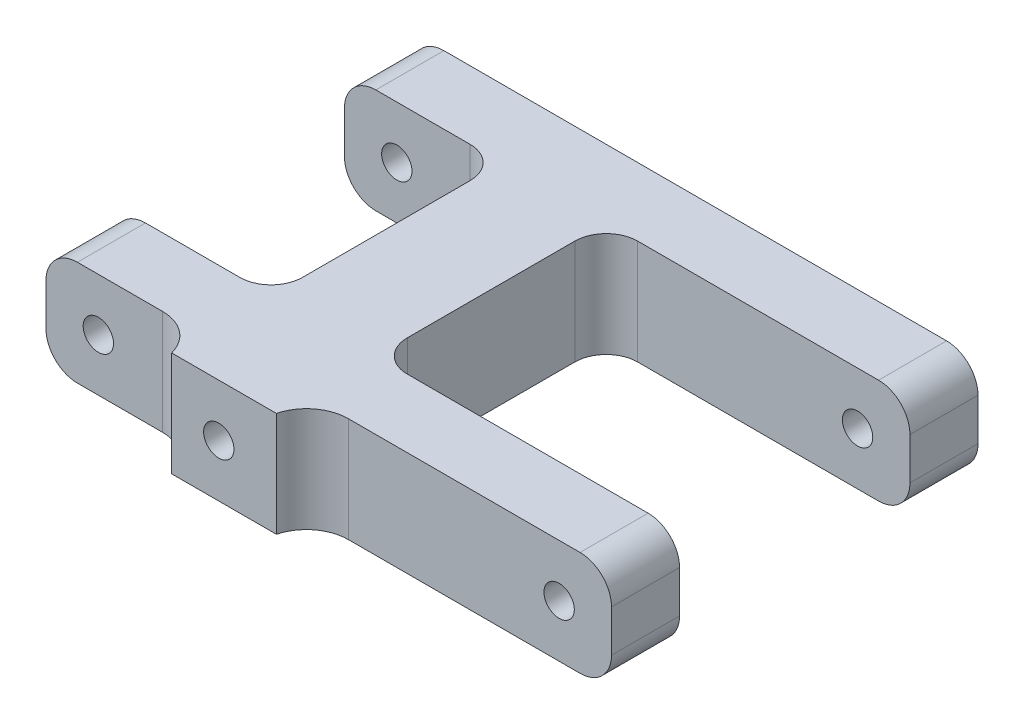
ISO-10303-21;
HEADER;
FILE_DESCRIPTION(('STEP AP214'),'2;1');
FILE_NAME('part.step','',(''),(''),'','','');
FILE_SCHEMA(('AUTOMOTIVE_DESIGN { 1 0 10303 214 1 1 1 1 }'));
ENDSEC;
DATA;
#1=APPLICATION_CONTEXT('core data for automotive mechanical design processes');
#2=APPLICATION_PROTOCOL_DEFINITION('international standard','automotive_design',2000,#1);
#3=PRODUCT_CONTEXT('',#1,'mechanical');
#4=PRODUCT('Part','Part','',(#3));
#5=PRODUCT_RELATED_PRODUCT_CATEGORY('part','',(#4));
#6=PRODUCT_DEFINITION_FORMATION('','',#4);
#7=PRODUCT_DEFINITION_CONTEXT('part definition',#1,'design');
#8=PRODUCT_DEFINITION('design','',#6,#7);
#9=PRODUCT_DEFINITION_SHAPE('','',#8);
#10=(LENGTH_UNIT() NAMED_UNIT(*) SI_UNIT(.MILLI.,.METRE.));
#11=(NAMED_UNIT(*) PLANE_ANGLE_UNIT() SI_UNIT($,.RADIAN.));
#12=(NAMED_UNIT(*) SI_UNIT($,.STERADIAN.) SOLID_ANGLE_UNIT());
#13=UNCERTAINTY_MEASURE_WITH_UNIT(LENGTH_MEASURE(1.E-05),#10,'distance_accuracy_value','');
#14=(GEOMETRIC_REPRESENTATION_CONTEXT(3) GLOBAL_UNCERTAINTY_ASSIGNED_CONTEXT((#13)) GLOBAL_UNIT_ASSIGNED_CONTEXT((#10,
#11,#12)) REPRESENTATION_CONTEXT('',''));
#15=CARTESIAN_POINT('',(0.,0.,0.));
#16=DIRECTION('',(0.,0.,1.));
#17=DIRECTION('',(1.,0.,0.));
#18=AXIS2_PLACEMENT_3D('',#15,#16,#17);
#19=CARTESIAN_POINT('',(0.,10.,35.));
#20=DIRECTION('',(0.,0.,-1.));
#21=DIRECTION('',(-1.,0.,0.));
#22=AXIS2_PLACEMENT_3D('',#19,#20,#21);
#23=PLANE('',#22);
#24=CARTESIAN_POINT('',(5.,5.,35.));
#25=DIRECTION('',(0.,0.,1.));
#26=DIRECTION('',(1.,0.,0.));
#27=AXIS2_PLACEMENT_3D('',#24,#25,#26);
#28=CIRCLE('',#27,1.45);
#29=CARTESIAN_POINT('',(6.45,5.,35.));
#30=VERTEX_POINT('',#29);
#31=EDGE_CURVE('E254',#30,#30,#28,.T.);
#32=ORIENTED_EDGE('',*,*,#31,.F.);
#33=EDGE_LOOP('',(#32));
#34=FACE_BOUND('',#33,.T.);
#35=DIRECTION('',(1.,0.,0.));
#36=VECTOR('',#35,1.);
#37=CARTESIAN_POINT('',(0.,0.,35.));
#38=LINE('',#37,#36);
#39=CARTESIAN_POINT('',(3.,0.,35.));
#40=VERTEX_POINT('',#39);
#41=CARTESIAN_POINT('',(11.1270166537926,0.,35.));
#42=VERTEX_POINT('',#41);
#43=EDGE_CURVE('E312',#40,#42,#38,.T.);
#44=ORIENTED_EDGE('',*,*,#43,.T.);
#45=DIRECTION('',(0.,-1.,0.));
#46=VECTOR('',#45,1.);
#47=CARTESIAN_POINT('',(11.1270166537926,10.,35.));
#48=LINE('',#47,#46);
#49=CARTESIAN_POINT('',(11.1270166537926,10.,35.));
#50=VERTEX_POINT('',#49);
#51=EDGE_CURVE('E54',#42,#50,#48,.F.);
#52=ORIENTED_EDGE('',*,*,#51,.T.);
#53=DIRECTION('',(1.,0.,0.));
#54=VECTOR('',#53,1.);
#55=CARTESIAN_POINT('',(0.,10.,35.));
#56=LINE('',#55,#54);
#57=CARTESIAN_POINT('',(3.,10.,35.));
#58=VERTEX_POINT('',#57);
#59=EDGE_CURVE('E305',#58,#50,#56,.T.);
#60=ORIENTED_EDGE('',*,*,#59,.F.);
#61=CARTESIAN_POINT('',(3.,7.,35.));
#62=DIRECTION('',(0.,0.,-1.));
#63=DIRECTION('',(-1.,0.,0.));
#64=AXIS2_PLACEMENT_3D('',#61,#62,#63);
#65=CIRCLE('',#64,3.);
#66=CARTESIAN_POINT('',(0.,7.,35.));
#67=VERTEX_POINT('',#66);
#68=EDGE_CURVE('E342',#58,#67,#65,.F.);
#69=ORIENTED_EDGE('',*,*,#68,.T.);
#70=DIRECTION('',(0.,-1.,0.));
#71=VECTOR('',#70,1.);
#72=CARTESIAN_POINT('',(0.,10.,35.));
#73=LINE('',#72,#71);
#74=CARTESIAN_POINT('',(0.,3.,35.));
#75=VERTEX_POINT('',#74);
#76=EDGE_CURVE('E325',#67,#75,#73,.T.);
#77=ORIENTED_EDGE('',*,*,#76,.T.);
#78=CARTESIAN_POINT('',(3.,3.,35.));
#79=DIRECTION('',(0.,0.,-1.));
#80=DIRECTION('',(-1.,0.,0.));
#81=AXIS2_PLACEMENT_3D('',#78,#79,#80);
#82=CIRCLE('',#81,3.);
#83=EDGE_CURVE('E344',#75,#40,#82,.F.);
#84=ORIENTED_EDGE('',*,*,#83,.T.);
#85=EDGE_LOOP('',(#44,#52,#60,#69,#77,#84));
#86=FACE_BOUND('',#85,.T.);
#87=ADVANCED_FACE('F33',(#34,#86),#23,.F.);
#88=CARTESIAN_POINT('',(49.,5.,35.));
#89=DIRECTION('',(0.,0.,1.));
#90=DIRECTION('',(1.,0.,0.));
#91=AXIS2_PLACEMENT_3D('',#88,#89,#90);
#92=CIRCLE('',#91,1.45);
#93=CARTESIAN_POINT('',(50.45,5.,35.));
#94=VERTEX_POINT('',#93);
#95=EDGE_CURVE('E244',#94,#94,#92,.T.);
#96=ORIENTED_EDGE('',*,*,#95,.F.);
#97=EDGE_LOOP('',(#96));
#98=FACE_BOUND('',#97,.T.);
#99=CARTESIAN_POINT('',(28.8729833462074,10.,35.));
#100=VERTEX_POINT('',#99);
#101=CARTESIAN_POINT('',(51.,10.,35.));
#102=VERTEX_POINT('',#101);
#103=EDGE_CURVE('E308',#100,#102,#56,.T.);
#104=ORIENTED_EDGE('',*,*,#103,.F.);
#105=DIRECTION('',(0.,1.,0.));
#106=VECTOR('',#105,1.);
#107=CARTESIAN_POINT('',(28.8729833462074,9.99999999999999,35.));
#108=LINE('',#107,#106);
#109=CARTESIAN_POINT('',(28.8729833462074,0.,35.));
#110=VERTEX_POINT('',#109);
#111=EDGE_CURVE('E447',#100,#110,#108,.F.);
#112=ORIENTED_EDGE('',*,*,#111,.T.);
#113=CARTESIAN_POINT('',(51.,0.,35.));
#114=VERTEX_POINT('',#113);
#115=EDGE_CURVE('E299',#110,#114,#38,.T.);
#116=ORIENTED_EDGE('',*,*,#115,.T.);
#117=CARTESIAN_POINT('',(51.,3.,35.));
#118=DIRECTION('',(0.,0.,-1.));
#119=DIRECTION('',(-1.,0.,0.));
#120=AXIS2_PLACEMENT_3D('',#117,#118,#119);
#121=CIRCLE('',#120,3.);
#122=CARTESIAN_POINT('',(54.,3.,35.));
#123=VERTEX_POINT('',#122);
#124=EDGE_CURVE('E340',#114,#123,#121,.F.);
#125=ORIENTED_EDGE('',*,*,#124,.T.);
#126=DIRECTION('',(0.,-1.,0.));
#127=VECTOR('',#126,1.);
#128=CARTESIAN_POINT('',(54.,10.,35.));
#129=LINE('',#128,#127);
#130=CARTESIAN_POINT('',(54.,7.,35.));
#131=VERTEX_POINT('',#130);
#132=EDGE_CURVE('E322',#131,#123,#129,.T.);
#133=ORIENTED_EDGE('',*,*,#132,.F.);
#134=CARTESIAN_POINT('',(51.,7.,35.));
#135=DIRECTION('',(0.,0.,-1.));
#136=DIRECTION('',(-1.,0.,0.));
#137=AXIS2_PLACEMENT_3D('',#134,#135,#136);
#138=CIRCLE('',#137,3.);
#139=EDGE_CURVE('E337',#131,#102,#138,.F.);
#140=ORIENTED_EDGE('',*,*,#139,.T.);
#141=EDGE_LOOP('',(#104,#112,#116,#125,#133,#140));
#142=FACE_BOUND('',#141,.T.);
#143=ADVANCED_FACE('F460',(#98,#142),#23,.F.);
#144=CARTESIAN_POINT('',(0.,10.,0.));
#145=DIRECTION('',(1.,0.,0.));
#146=DIRECTION('',(0.,0.,-1.));
#147=AXIS2_PLACEMENT_3D('',#144,#145,#146);
#148=PLANE('',#147);
#149=DIRECTION('',(0.,-1.,0.));
#150=VECTOR('',#149,1.);
#151=CARTESIAN_POINT('',(0.,10.,0.));
#152=LINE('',#151,#150);
#153=CARTESIAN_POINT('',(0.,7.,0.));
#154=VERTEX_POINT('',#153);
#155=CARTESIAN_POINT('',(0.,3.,0.));
#156=VERTEX_POINT('',#155);
#157=EDGE_CURVE('E311',#154,#156,#152,.T.);
#158=ORIENTED_EDGE('',*,*,#157,.T.);
#159=DIRECTION('',(0.,0.,1.));
#160=VECTOR('',#159,1.);
#161=CARTESIAN_POINT('',(0.,3.,0.));
#162=LINE('',#161,#160);
#163=CARTESIAN_POINT('',(0.,3.,6.5));
#164=VERTEX_POINT('',#163);
#165=EDGE_CURVE('E376',#156,#164,#162,.T.);
#166=ORIENTED_EDGE('',*,*,#165,.T.);
#167=DIRECTION('',(0.,-1.,0.));
#168=VECTOR('',#167,1.);
#169=CARTESIAN_POINT('',(0.,10.,6.5));
#170=LINE('',#169,#168);
#171=CARTESIAN_POINT('',(0.,7.,6.5));
#172=VERTEX_POINT('',#171);
#173=EDGE_CURVE('E264',#172,#164,#170,.T.);
#174=ORIENTED_EDGE('',*,*,#173,.F.);
#175=DIRECTION('',(0.,0.,1.));
#176=VECTOR('',#175,1.);
#177=CARTESIAN_POINT('',(0.,7.,0.));
#178=LINE('',#177,#176);
#179=EDGE_CURVE('E374',#172,#154,#178,.F.);
#180=ORIENTED_EDGE('',*,*,#179,.T.);
#181=EDGE_LOOP('',(#158,#166,#174,#180));
#182=FACE_BOUND('',#181,.T.);
#183=ADVANCED_FACE('F481',(#182),#148,.F.);
#184=CARTESIAN_POINT('',(54.,10.,0.));
#185=DIRECTION('',(-1.,0.,0.));
#186=DIRECTION('',(0.,0.,1.));
#187=AXIS2_PLACEMENT_3D('',#184,#185,#186);
#188=PLANE('',#187);
#189=ORIENTED_EDGE('',*,*,#132,.T.);
#190=DIRECTION('',(0.,0.,-1.));
#191=VECTOR('',#190,1.);
#192=CARTESIAN_POINT('',(54.,3.,0.));
#193=LINE('',#192,#191);
#194=CARTESIAN_POINT('',(54.,3.,28.5));
#195=VERTEX_POINT('',#194);
#196=EDGE_CURVE('E404',#123,#195,#193,.T.);
#197=ORIENTED_EDGE('',*,*,#196,.T.);
#198=DIRECTION('',(0.,-1.,0.));
#199=VECTOR('',#198,1.);
#200=CARTESIAN_POINT('',(54.,10.,28.5));
#201=LINE('',#200,#199);
#202=CARTESIAN_POINT('',(54.,7.,28.5));
#203=VERTEX_POINT('',#202);
#204=EDGE_CURVE('E279',#203,#195,#201,.T.);
#205=ORIENTED_EDGE('',*,*,#204,.F.);
#206=DIRECTION('',(0.,0.,-1.));
#207=VECTOR('',#206,1.);
#208=CARTESIAN_POINT('',(54.,7.,35.));
#209=LINE('',#208,#207);
#210=EDGE_CURVE('E402',#203,#131,#209,.F.);
#211=ORIENTED_EDGE('',*,*,#210,.T.);
#212=EDGE_LOOP('',(#189,#197,#205,#211));
#213=FACE_BOUND('',#212,.T.);
#214=ADVANCED_FACE('F491',(#213),#188,.F.);
#215=DIRECTION('',(0.,1.,0.));
#216=VECTOR('',#215,1.);
#217=CARTESIAN_POINT('',(0.,10.,28.5));
#218=LINE('',#217,#216);
#219=CARTESIAN_POINT('',(0.,3.,28.5));
#220=VERTEX_POINT('',#219);
#221=CARTESIAN_POINT('',(0.,7.,28.5));
#222=VERTEX_POINT('',#221);
#223=EDGE_CURVE('E269',#220,#222,#218,.T.);
#224=ORIENTED_EDGE('',*,*,#223,.F.);
#225=DIRECTION('',(0.,0.,1.));
#226=VECTOR('',#225,1.);
#227=CARTESIAN_POINT('',(0.,3.,0.));
#228=LINE('',#227,#226);
#229=EDGE_CURVE('E334',#220,#75,#228,.T.);
#230=ORIENTED_EDGE('',*,*,#229,.T.);
#231=ORIENTED_EDGE('',*,*,#76,.F.);
#232=DIRECTION('',(0.,0.,1.));
#233=VECTOR('',#232,1.);
#234=CARTESIAN_POINT('',(0.,7.,28.5));
#235=LINE('',#234,#233);
#236=EDGE_CURVE('E328',#67,#222,#235,.F.);
#237=ORIENTED_EDGE('',*,*,#236,.T.);
#238=EDGE_LOOP('',(#224,#230,#231,#237));
#239=FACE_BOUND('',#238,.T.);
#240=ADVANCED_FACE('F488',(#239),#148,.F.);
#241=DIRECTION('',(0.,-1.,0.));
#242=VECTOR('',#241,1.);
#243=CARTESIAN_POINT('',(54.,10.,0.));
#244=LINE('',#243,#242);
#245=CARTESIAN_POINT('',(54.,7.,0.));
#246=VERTEX_POINT('',#245);
#247=CARTESIAN_POINT('',(54.,3.,0.));
#248=VERTEX_POINT('',#247);
#249=EDGE_CURVE('E319',#246,#248,#244,.T.);
#250=ORIENTED_EDGE('',*,*,#249,.F.);
#251=DIRECTION('',(0.,0.,-1.));
#252=VECTOR('',#251,1.);
#253=CARTESIAN_POINT('',(54.,7.,6.5));
#254=LINE('',#253,#252);
#255=CARTESIAN_POINT('',(54.,7.,6.5));
#256=VERTEX_POINT('',#255);
#257=EDGE_CURVE('E395',#246,#256,#254,.F.);
#258=ORIENTED_EDGE('',*,*,#257,.T.);
#259=DIRECTION('',(0.,1.,0.));
#260=VECTOR('',#259,1.);
#261=CARTESIAN_POINT('',(54.,10.,6.5));
#262=LINE('',#261,#260);
#263=CARTESIAN_POINT('',(54.,3.,6.5));
#264=VERTEX_POINT('',#263);
#265=EDGE_CURVE('E289',#264,#256,#262,.T.);
#266=ORIENTED_EDGE('',*,*,#265,.F.);
#267=DIRECTION('',(0.,0.,-1.));
#268=VECTOR('',#267,1.);
#269=CARTESIAN_POINT('',(54.,3.,0.));
#270=LINE('',#269,#268);
#271=EDGE_CURVE('E392',#264,#248,#270,.T.);
#272=ORIENTED_EDGE('',*,*,#271,.T.);
#273=EDGE_LOOP('',(#250,#258,#266,#272));
#274=FACE_BOUND('',#273,.T.);
#275=ADVANCED_FACE('F486',(#274),#188,.F.);
#276=CARTESIAN_POINT('',(0.,10.,0.));
#277=DIRECTION('',(0.,0.,1.));
#278=DIRECTION('',(1.,0.,0.));
#279=AXIS2_PLACEMENT_3D('',#276,#277,#278);
#280=PLANE('',#279);
#281=CARTESIAN_POINT('',(49.,5.,0.));
#282=DIRECTION('',(0.,0.,1.));
#283=DIRECTION('',(1.,0.,0.));
#284=AXIS2_PLACEMENT_3D('',#281,#282,#283);
#285=CIRCLE('',#284,1.45);
#286=CARTESIAN_POINT('',(50.45,5.,0.));
#287=VERTEX_POINT('',#286);
#288=EDGE_CURVE('E245',#287,#287,#285,.T.);
#289=ORIENTED_EDGE('',*,*,#288,.T.);
#290=EDGE_LOOP('',(#289));
#291=FACE_BOUND('',#290,.T.);
#292=CARTESIAN_POINT('',(5.,5.,0.));
#293=DIRECTION('',(0.,0.,1.));
#294=DIRECTION('',(1.,0.,0.));
#295=AXIS2_PLACEMENT_3D('',#292,#293,#294);
#296=CIRCLE('',#295,1.45);
#297=CARTESIAN_POINT('',(6.45,5.,0.));
#298=VERTEX_POINT('',#297);
#299=EDGE_CURVE('E255',#298,#298,#296,.T.);
#300=ORIENTED_EDGE('',*,*,#299,.T.);
#301=EDGE_LOOP('',(#300));
#302=FACE_BOUND('',#301,.T.);
#303=DIRECTION('',(-1.,0.,0.));
#304=VECTOR('',#303,1.);
#305=CARTESIAN_POINT('',(0.,0.,0.));
#306=LINE('',#305,#304);
#307=CARTESIAN_POINT('',(51.,0.,0.));
#308=VERTEX_POINT('',#307);
#309=CARTESIAN_POINT('',(3.,0.,0.));
#310=VERTEX_POINT('',#309);
#311=EDGE_CURVE('E314',#308,#310,#306,.T.);
#312=ORIENTED_EDGE('',*,*,#311,.T.);
#313=CARTESIAN_POINT('',(3.,3.,0.));
#314=DIRECTION('',(0.,0.,1.));
#315=DIRECTION('',(1.,0.,0.));
#316=AXIS2_PLACEMENT_3D('',#313,#314,#315);
#317=CIRCLE('',#316,3.);
#318=EDGE_CURVE('E390',#310,#156,#317,.F.);
#319=ORIENTED_EDGE('',*,*,#318,.T.);
#320=ORIENTED_EDGE('',*,*,#157,.F.);
#321=CARTESIAN_POINT('',(3.,7.,0.));
#322=DIRECTION('',(0.,0.,1.));
#323=DIRECTION('',(1.,0.,0.));
#324=AXIS2_PLACEMENT_3D('',#321,#322,#323);
#325=CIRCLE('',#324,3.);
#326=CARTESIAN_POINT('',(3.,10.,0.));
#327=VERTEX_POINT('',#326);
#328=EDGE_CURVE('E388',#154,#327,#325,.F.);
#329=ORIENTED_EDGE('',*,*,#328,.T.);
#330=DIRECTION('',(-1.,0.,0.));
#331=VECTOR('',#330,1.);
#332=CARTESIAN_POINT('',(0.,10.,0.));
#333=LINE('',#332,#331);
#334=CARTESIAN_POINT('',(51.,10.,0.));
#335=VERTEX_POINT('',#334);
#336=EDGE_CURVE('E307',#335,#327,#333,.T.);
#337=ORIENTED_EDGE('',*,*,#336,.F.);
#338=CARTESIAN_POINT('',(51.,7.,0.));
#339=DIRECTION('',(0.,0.,1.));
#340=DIRECTION('',(1.,0.,0.));
#341=AXIS2_PLACEMENT_3D('',#338,#339,#340);
#342=CIRCLE('',#341,3.);
#343=EDGE_CURVE('E386',#335,#246,#342,.F.);
#344=ORIENTED_EDGE('',*,*,#343,.T.);
#345=ORIENTED_EDGE('',*,*,#249,.T.);
#346=CARTESIAN_POINT('',(51.,3.,0.));
#347=DIRECTION('',(0.,0.,1.));
#348=DIRECTION('',(1.,0.,0.));
#349=AXIS2_PLACEMENT_3D('',#346,#347,#348);
#350=CIRCLE('',#349,3.);
#351=EDGE_CURVE('E384',#248,#308,#350,.F.);
#352=ORIENTED_EDGE('',*,*,#351,.T.);
#353=EDGE_LOOP('',(#312,#319,#320,#329,#337,#344,#345,#352));
#354=FACE_BOUND('',#353,.T.);
#355=ADVANCED_FACE('F577',(#291,#302,#354),#280,.F.);
#356=CARTESIAN_POINT('',(0.,10.,0.));
#357=DIRECTION('',(0.,1.,0.));
#358=DIRECTION('',(0.,0.,1.));
#359=AXIS2_PLACEMENT_3D('',#356,#357,#358);
#360=PLANE('',#359);
#361=DIRECTION('',(0.,0.,-1.));
#362=VECTOR('',#361,1.);
#363=CARTESIAN_POINT('',(15.,10.,6.5));
#364=LINE('',#363,#362);
#365=CARTESIAN_POINT('',(15.,10.,25.5));
#366=VERTEX_POINT('',#365);
#367=CARTESIAN_POINT('',(15.,10.,9.5));
#368=VERTEX_POINT('',#367);
#369=EDGE_CURVE('E268',#366,#368,#364,.T.);
#370=ORIENTED_EDGE('',*,*,#369,.F.);
#371=CARTESIAN_POINT('',(12.,10.,25.5));
#372=DIRECTION('',(0.,1.,0.));
#373=DIRECTION('',(0.,0.,1.));
#374=AXIS2_PLACEMENT_3D('',#371,#372,#373);
#375=CIRCLE('',#374,3.);
#376=CARTESIAN_POINT('',(12.,10.,28.5));
#377=VERTEX_POINT('',#376);
#378=EDGE_CURVE('E440',#366,#377,#375,.F.);
#379=ORIENTED_EDGE('',*,*,#378,.T.);
#380=DIRECTION('',(-1.,0.,0.));
#381=VECTOR('',#380,1.);
#382=CARTESIAN_POINT('',(15.,10.,28.5));
#383=LINE('',#382,#381);
#384=CARTESIAN_POINT('',(3.,10.,28.5));
#385=VERTEX_POINT('',#384);
#386=EDGE_CURVE('E280',#377,#385,#383,.T.);
#387=ORIENTED_EDGE('',*,*,#386,.T.);
#388=DIRECTION('',(0.,0.,1.));
#389=VECTOR('',#388,1.);
#390=CARTESIAN_POINT('',(3.,10.,35.));
#391=LINE('',#390,#389);
#392=EDGE_CURVE('E371',#385,#58,#391,.T.);
#393=ORIENTED_EDGE('',*,*,#392,.T.);
#394=ORIENTED_EDGE('',*,*,#59,.T.);
#395=CARTESIAN_POINT('',(11.1270166537926,10.,39.));
#396=DIRECTION('',(0.,1.,0.));
#397=DIRECTION('',(0.,0.,1.));
#398=AXIS2_PLACEMENT_3D('',#395,#396,#397);
#399=CIRCLE('',#398,4.);
#400=CARTESIAN_POINT('',(15.,10.,38.));
#401=VERTEX_POINT('',#400);
#402=EDGE_CURVE('E11',#50,#401,#399,.F.);
#403=ORIENTED_EDGE('',*,*,#402,.T.);
#404=DIRECTION('',(-1.,0.,0.));
#405=VECTOR('',#404,1.);
#406=CARTESIAN_POINT('',(15.,10.,38.));
#407=LINE('',#406,#405);
#408=CARTESIAN_POINT('',(25.,10.,38.));
#409=VERTEX_POINT('',#408);
#410=EDGE_CURVE('E234',#409,#401,#407,.T.);
#411=ORIENTED_EDGE('',*,*,#410,.F.);
#412=CARTESIAN_POINT('',(28.8729833462074,10.,39.));
#413=DIRECTION('',(0.,1.,0.));
#414=DIRECTION('',(0.,0.,1.));
#415=AXIS2_PLACEMENT_3D('',#412,#413,#414);
#416=CIRCLE('',#415,4.);
#417=EDGE_CURVE('E451',#409,#100,#416,.F.);
#418=ORIENTED_EDGE('',*,*,#417,.T.);
#419=ORIENTED_EDGE('',*,*,#103,.T.);
#420=DIRECTION('',(0.,0.,-1.));
#421=VECTOR('',#420,1.);
#422=CARTESIAN_POINT('',(51.,10.,28.5));
#423=LINE('',#422,#421);
#424=CARTESIAN_POINT('',(51.,10.,28.5));
#425=VERTEX_POINT('',#424);
#426=EDGE_CURVE('E362',#102,#425,#423,.T.);
#427=ORIENTED_EDGE('',*,*,#426,.T.);
#428=DIRECTION('',(1.,0.,0.));
#429=VECTOR('',#428,1.);
#430=CARTESIAN_POINT('',(25.,10.,28.5));
#431=LINE('',#430,#429);
#432=CARTESIAN_POINT('',(28.,10.,28.5));
#433=VERTEX_POINT('',#432);
#434=EDGE_CURVE('E297',#433,#425,#431,.T.);
#435=ORIENTED_EDGE('',*,*,#434,.F.);
#436=CARTESIAN_POINT('',(28.,10.,25.5));
#437=DIRECTION('',(0.,1.,0.));
#438=DIRECTION('',(0.,0.,1.));
#439=AXIS2_PLACEMENT_3D('',#436,#437,#438);
#440=CIRCLE('',#439,3.);
#441=CARTESIAN_POINT('',(25.,10.,25.5));
#442=VERTEX_POINT('',#441);
#443=EDGE_CURVE('E434',#433,#442,#440,.F.);
#444=ORIENTED_EDGE('',*,*,#443,.T.);
#445=DIRECTION('',(0.,0.,1.));
#446=VECTOR('',#445,1.);
#447=CARTESIAN_POINT('',(25.,10.,28.5));
#448=LINE('',#447,#446);
#449=CARTESIAN_POINT('',(25.,10.,9.5));
#450=VERTEX_POINT('',#449);
#451=EDGE_CURVE('E288',#450,#442,#448,.T.);
#452=ORIENTED_EDGE('',*,*,#451,.F.);
#453=CARTESIAN_POINT('',(28.,10.,9.5));
#454=DIRECTION('',(0.,1.,0.));
#455=DIRECTION('',(0.,0.,1.));
#456=AXIS2_PLACEMENT_3D('',#453,#454,#455);
#457=CIRCLE('',#456,3.);
#458=CARTESIAN_POINT('',(28.,10.,6.5));
#459=VERTEX_POINT('',#458);
#460=EDGE_CURVE('E436',#450,#459,#457,.F.);
#461=ORIENTED_EDGE('',*,*,#460,.T.);
#462=DIRECTION('',(1.,0.,0.));
#463=VECTOR('',#462,1.);
#464=CARTESIAN_POINT('',(25.,10.,6.5));
#465=LINE('',#464,#463);
#466=CARTESIAN_POINT('',(51.,10.,6.5));
#467=VERTEX_POINT('',#466);
#468=EDGE_CURVE('E300',#459,#467,#465,.T.);
#469=ORIENTED_EDGE('',*,*,#468,.T.);
#470=DIRECTION('',(0.,0.,-1.));
#471=VECTOR('',#470,1.);
#472=CARTESIAN_POINT('',(51.,10.,0.));
#473=LINE('',#472,#471);
#474=EDGE_CURVE('E365',#467,#335,#473,.T.);
#475=ORIENTED_EDGE('',*,*,#474,.T.);
#476=ORIENTED_EDGE('',*,*,#336,.T.);
#477=DIRECTION('',(0.,0.,1.));
#478=VECTOR('',#477,1.);
#479=CARTESIAN_POINT('',(3.,10.,6.5));
#480=LINE('',#479,#478);
#481=CARTESIAN_POINT('',(3.,10.,6.5));
#482=VERTEX_POINT('',#481);
#483=EDGE_CURVE('E368',#327,#482,#480,.T.);
#484=ORIENTED_EDGE('',*,*,#483,.T.);
#485=DIRECTION('',(-1.,0.,0.));
#486=VECTOR('',#485,1.);
#487=CARTESIAN_POINT('',(15.,10.,6.5));
#488=LINE('',#487,#486);
#489=CARTESIAN_POINT('',(12.,10.,6.5));
#490=VERTEX_POINT('',#489);
#491=EDGE_CURVE('E277',#490,#482,#488,.T.);
#492=ORIENTED_EDGE('',*,*,#491,.F.);
#493=CARTESIAN_POINT('',(12.,10.,9.5));
#494=DIRECTION('',(0.,1.,0.));
#495=DIRECTION('',(0.,0.,1.));
#496=AXIS2_PLACEMENT_3D('',#493,#494,#495);
#497=CIRCLE('',#496,3.);
#498=EDGE_CURVE('E446',#490,#368,#497,.F.);
#499=ORIENTED_EDGE('',*,*,#498,.T.);
#500=EDGE_LOOP('',(#370,#379,#387,#393,#394,#403,#411,#418,#419,#427,#435,#444,#452,#461,#469,
#475,#476,#484,#492,#499));
#501=FACE_BOUND('',#500,.T.);
#502=ADVANCED_FACE('F456',(#501),#360,.T.);
#503=CARTESIAN_POINT('',(0.,0.,0.));
#504=DIRECTION('',(0.,1.,0.));
#505=DIRECTION('',(0.,0.,1.));
#506=AXIS2_PLACEMENT_3D('',#503,#504,#505);
#507=PLANE('',#506);
#508=ORIENTED_EDGE('',*,*,#43,.F.);
#509=DIRECTION('',(0.,0.,1.));
#510=VECTOR('',#509,1.);
#511=CARTESIAN_POINT('',(3.,0.,0.));
#512=LINE('',#511,#510);
#513=CARTESIAN_POINT('',(3.,0.,28.5));
#514=VERTEX_POINT('',#513);
#515=EDGE_CURVE('E354',#40,#514,#512,.F.);
#516=ORIENTED_EDGE('',*,*,#515,.T.);
#517=DIRECTION('',(-1.,0.,0.));
#518=VECTOR('',#517,1.);
#519=CARTESIAN_POINT('',(15.,0.,28.5));
#520=LINE('',#519,#518);
#521=CARTESIAN_POINT('',(12.,0.,28.5));
#522=VERTEX_POINT('',#521);
#523=EDGE_CURVE('E282',#522,#514,#520,.T.);
#524=ORIENTED_EDGE('',*,*,#523,.F.);
#525=CARTESIAN_POINT('',(12.,0.,25.5));
#526=DIRECTION('',(0.,1.,0.));
#527=DIRECTION('',(0.,0.,1.));
#528=AXIS2_PLACEMENT_3D('',#525,#526,#527);
#529=CIRCLE('',#528,3.);
#530=CARTESIAN_POINT('',(15.,0.,25.5));
#531=VERTEX_POINT('',#530);
#532=EDGE_CURVE('E442',#522,#531,#529,.T.);
#533=ORIENTED_EDGE('',*,*,#532,.T.);
#534=DIRECTION('',(0.,0.,1.));
#535=VECTOR('',#534,1.);
#536=CARTESIAN_POINT('',(15.,0.,6.5));
#537=LINE('',#536,#535);
#538=CARTESIAN_POINT('',(15.,0.,9.5));
#539=VERTEX_POINT('',#538);
#540=EDGE_CURVE('E265',#539,#531,#537,.T.);
#541=ORIENTED_EDGE('',*,*,#540,.F.);
#542=CARTESIAN_POINT('',(12.,0.,9.5));
#543=DIRECTION('',(0.,1.,0.));
#544=DIRECTION('',(0.,0.,1.));
#545=AXIS2_PLACEMENT_3D('',#542,#543,#544);
#546=CIRCLE('',#545,3.);
#547=CARTESIAN_POINT('',(12.,0.,6.5));
#548=VERTEX_POINT('',#547);
#549=EDGE_CURVE('E444',#539,#548,#546,.T.);
#550=ORIENTED_EDGE('',*,*,#549,.T.);
#551=DIRECTION('',(-1.,0.,0.));
#552=VECTOR('',#551,1.);
#553=CARTESIAN_POINT('',(15.,0.,6.5));
#554=LINE('',#553,#552);
#555=CARTESIAN_POINT('',(3.,0.,6.5));
#556=VERTEX_POINT('',#555);
#557=EDGE_CURVE('E272',#548,#556,#554,.T.);
#558=ORIENTED_EDGE('',*,*,#557,.T.);
#559=DIRECTION('',(0.,0.,1.));
#560=VECTOR('',#559,1.);
#561=CARTESIAN_POINT('',(3.,0.,0.));
#562=LINE('',#561,#560);
#563=EDGE_CURVE('E352',#556,#310,#562,.F.);
#564=ORIENTED_EDGE('',*,*,#563,.T.);
#565=ORIENTED_EDGE('',*,*,#311,.F.);
#566=DIRECTION('',(0.,0.,-1.));
#567=VECTOR('',#566,1.);
#568=CARTESIAN_POINT('',(51.,0.,0.));
#569=LINE('',#568,#567);
#570=CARTESIAN_POINT('',(51.,0.,6.5));
#571=VERTEX_POINT('',#570);
#572=EDGE_CURVE('E349',#308,#571,#569,.F.);
#573=ORIENTED_EDGE('',*,*,#572,.T.);
#574=DIRECTION('',(1.,0.,0.));
#575=VECTOR('',#574,1.);
#576=CARTESIAN_POINT('',(25.,0.,6.5));
#577=LINE('',#576,#575);
#578=CARTESIAN_POINT('',(28.,0.,6.5));
#579=VERTEX_POINT('',#578);
#580=EDGE_CURVE('E302',#579,#571,#577,.T.);
#581=ORIENTED_EDGE('',*,*,#580,.F.);
#582=CARTESIAN_POINT('',(28.,0.,9.5));
#583=DIRECTION('',(0.,1.,0.));
#584=DIRECTION('',(0.,0.,1.));
#585=AXIS2_PLACEMENT_3D('',#582,#583,#584);
#586=CIRCLE('',#585,3.);
#587=CARTESIAN_POINT('',(25.,0.,9.5));
#588=VERTEX_POINT('',#587);
#589=EDGE_CURVE('E438',#579,#588,#586,.T.);
#590=ORIENTED_EDGE('',*,*,#589,.T.);
#591=DIRECTION('',(0.,0.,-1.));
#592=VECTOR('',#591,1.);
#593=CARTESIAN_POINT('',(25.,0.,28.5));
#594=LINE('',#593,#592);
#595=CARTESIAN_POINT('',(25.,0.,25.5));
#596=VERTEX_POINT('',#595);
#597=EDGE_CURVE('E285',#596,#588,#594,.T.);
#598=ORIENTED_EDGE('',*,*,#597,.F.);
#599=CARTESIAN_POINT('',(28.,0.,25.5));
#600=DIRECTION('',(0.,1.,0.));
#601=DIRECTION('',(0.,0.,1.));
#602=AXIS2_PLACEMENT_3D('',#599,#600,#601);
#603=CIRCLE('',#602,3.);
#604=CARTESIAN_POINT('',(28.,0.,28.5));
#605=VERTEX_POINT('',#604);
#606=EDGE_CURVE('E432',#596,#605,#603,.T.);
#607=ORIENTED_EDGE('',*,*,#606,.T.);
#608=DIRECTION('',(1.,0.,0.));
#609=VECTOR('',#608,1.);
#610=CARTESIAN_POINT('',(25.,0.,28.5));
#611=LINE('',#610,#609);
#612=CARTESIAN_POINT('',(51.,0.,28.5));
#613=VERTEX_POINT('',#612);
#614=EDGE_CURVE('E292',#605,#613,#611,.T.);
#615=ORIENTED_EDGE('',*,*,#614,.T.);
#616=DIRECTION('',(0.,0.,-1.));
#617=VECTOR('',#616,1.);
#618=CARTESIAN_POINT('',(51.,0.,0.));
#619=LINE('',#618,#617);
#620=EDGE_CURVE('E346',#613,#114,#619,.F.);
#621=ORIENTED_EDGE('',*,*,#620,.T.);
#622=ORIENTED_EDGE('',*,*,#115,.F.);
#623=CARTESIAN_POINT('',(28.8729833462074,0.,39.));
#624=DIRECTION('',(0.,1.,0.));
#625=DIRECTION('',(0.,0.,1.));
#626=AXIS2_PLACEMENT_3D('',#623,#624,#625);
#627=CIRCLE('',#626,4.);
#628=CARTESIAN_POINT('',(25.,0.,38.));
#629=VERTEX_POINT('',#628);
#630=EDGE_CURVE('E220',#110,#629,#627,.T.);
#631=ORIENTED_EDGE('',*,*,#630,.T.);
#632=DIRECTION('',(1.,0.,0.));
#633=VECTOR('',#632,1.);
#634=CARTESIAN_POINT('',(15.,0.,38.));
#635=LINE('',#634,#633);
#636=CARTESIAN_POINT('',(15.,0.,38.));
#637=VERTEX_POINT('',#636);
#638=EDGE_CURVE('E222',#637,#629,#635,.T.);
#639=ORIENTED_EDGE('',*,*,#638,.F.);
#640=CARTESIAN_POINT('',(11.1270166537926,0.,39.));
#641=DIRECTION('',(0.,1.,0.));
#642=DIRECTION('',(0.,0.,1.));
#643=AXIS2_PLACEMENT_3D('',#640,#641,#642);
#644=CIRCLE('',#643,4.);
#645=EDGE_CURVE('E41',#637,#42,#644,.T.);
#646=ORIENTED_EDGE('',*,*,#645,.T.);
#647=EDGE_LOOP('',(#508,#516,#524,#533,#541,#550,#558,#564,#565,#573,#581,#590,#598,#607,#615,
#621,#622,#631,#639,#646));
#648=FACE_BOUND('',#647,.T.);
#649=ADVANCED_FACE('F223',(#648),#507,.F.);
#650=CARTESIAN_POINT('',(25.,10.,28.5));
#651=DIRECTION('',(0.,0.,1.));
#652=DIRECTION('',(1.,0.,0.));
#653=AXIS2_PLACEMENT_3D('',#650,#651,#652);
#654=PLANE('',#653);
#655=CARTESIAN_POINT('',(49.,5.,28.5));
#656=DIRECTION('',(0.,0.,1.));
#657=DIRECTION('',(1.,0.,0.));
#658=AXIS2_PLACEMENT_3D('',#655,#656,#657);
#659=CIRCLE('',#658,1.45);
#660=CARTESIAN_POINT('',(50.45,5.,28.5));
#661=VERTEX_POINT('',#660);
#662=EDGE_CURVE('E251',#661,#661,#659,.T.);
#663=ORIENTED_EDGE('',*,*,#662,.T.);
#664=EDGE_LOOP('',(#663));
#665=FACE_BOUND('',#664,.T.);
#666=ORIENTED_EDGE('',*,*,#614,.F.);
#667=DIRECTION('',(0.,-1.,0.));
#668=VECTOR('',#667,1.);
#669=CARTESIAN_POINT('',(28.,10.,28.5));
#670=LINE('',#669,#668);
#671=EDGE_CURVE('E418',#605,#433,#670,.F.);
#672=ORIENTED_EDGE('',*,*,#671,.T.);
#673=ORIENTED_EDGE('',*,*,#434,.T.);
#674=CARTESIAN_POINT('',(51.,7.,28.5));
#675=DIRECTION('',(0.,0.,1.));
#676=DIRECTION('',(1.,0.,0.));
#677=AXIS2_PLACEMENT_3D('',#674,#675,#676);
#678=CIRCLE('',#677,3.);
#679=EDGE_CURVE('E407',#425,#203,#678,.F.);
#680=ORIENTED_EDGE('',*,*,#679,.T.);
#681=ORIENTED_EDGE('',*,*,#204,.T.);
#682=CARTESIAN_POINT('',(51.,3.,28.5));
#683=DIRECTION('',(0.,0.,1.));
#684=DIRECTION('',(1.,0.,0.));
#685=AXIS2_PLACEMENT_3D('',#682,#683,#684);
#686=CIRCLE('',#685,3.);
#687=EDGE_CURVE('E409',#195,#613,#686,.F.);
#688=ORIENTED_EDGE('',*,*,#687,.T.);
#689=EDGE_LOOP('',(#666,#672,#673,#680,#681,#688));
#690=FACE_BOUND('',#689,.T.);
#691=ADVANCED_FACE('F615',(#665,#690),#654,.F.);
#692=CARTESIAN_POINT('',(25.,10.,6.5));
#693=DIRECTION('',(0.,0.,-1.));
#694=DIRECTION('',(0.,1.,0.));
#695=AXIS2_PLACEMENT_3D('',#692,#693,#694);
#696=PLANE('',#695);
#697=CARTESIAN_POINT('',(49.,5.,6.5));
#698=DIRECTION('',(0.,0.,-1.));
#699=DIRECTION('',(0.,1.,0.));
#700=AXIS2_PLACEMENT_3D('',#697,#698,#699);
#701=CIRCLE('',#700,1.45);
#702=CARTESIAN_POINT('',(49.,6.45,6.5));
#703=VERTEX_POINT('',#702);
#704=EDGE_CURVE('E248',#703,#703,#701,.T.);
#705=ORIENTED_EDGE('',*,*,#704,.T.);
#706=EDGE_LOOP('',(#705));
#707=FACE_BOUND('',#706,.T.);
#708=ORIENTED_EDGE('',*,*,#468,.F.);
#709=DIRECTION('',(0.,1.,0.));
#710=VECTOR('',#709,1.);
#711=CARTESIAN_POINT('',(28.,10.,6.5));
#712=LINE('',#711,#710);
#713=EDGE_CURVE('E420',#459,#579,#712,.F.);
#714=ORIENTED_EDGE('',*,*,#713,.T.);
#715=ORIENTED_EDGE('',*,*,#580,.T.);
#716=CARTESIAN_POINT('',(51.,3.,6.5));
#717=DIRECTION('',(0.,0.,-1.));
#718=DIRECTION('',(0.,1.,0.));
#719=AXIS2_PLACEMENT_3D('',#716,#717,#718);
#720=CIRCLE('',#719,3.);
#721=EDGE_CURVE('E397',#571,#264,#720,.F.);
#722=ORIENTED_EDGE('',*,*,#721,.T.);
#723=ORIENTED_EDGE('',*,*,#265,.T.);
#724=CARTESIAN_POINT('',(51.,7.,6.5));
#725=DIRECTION('',(0.,0.,-1.));
#726=DIRECTION('',(0.,1.,0.));
#727=AXIS2_PLACEMENT_3D('',#724,#725,#726);
#728=CIRCLE('',#727,3.);
#729=EDGE_CURVE('E399',#256,#467,#728,.F.);
#730=ORIENTED_EDGE('',*,*,#729,.T.);
#731=EDGE_LOOP('',(#708,#714,#715,#722,#723,#730));
#732=FACE_BOUND('',#731,.T.);
#733=ADVANCED_FACE('F588',(#707,#732),#696,.F.);
#734=CARTESIAN_POINT('',(25.,0.,0.));
#735=DIRECTION('',(1.,0.,0.));
#736=DIRECTION('',(0.,0.,-1.));
#737=AXIS2_PLACEMENT_3D('',#734,#735,#736);
#738=PLANE('',#737);
#739=ORIENTED_EDGE('',*,*,#451,.T.);
#740=DIRECTION('',(0.,-1.,0.));
#741=VECTOR('',#740,1.);
#742=CARTESIAN_POINT('',(25.,0.,25.5));
#743=LINE('',#742,#741);
#744=EDGE_CURVE('E415',#442,#596,#743,.T.);
#745=ORIENTED_EDGE('',*,*,#744,.T.);
#746=ORIENTED_EDGE('',*,*,#597,.T.);
#747=DIRECTION('',(0.,1.,0.));
#748=VECTOR('',#747,1.);
#749=CARTESIAN_POINT('',(25.,0.,9.5));
#750=LINE('',#749,#748);
#751=EDGE_CURVE('E412',#588,#450,#750,.T.);
#752=ORIENTED_EDGE('',*,*,#751,.T.);
#753=EDGE_LOOP('',(#739,#745,#746,#752));
#754=FACE_BOUND('',#753,.T.);
#755=ADVANCED_FACE('F622',(#754),#738,.T.);
#756=CARTESIAN_POINT('',(15.,10.,6.5));
#757=DIRECTION('',(0.,0.,-1.));
#758=DIRECTION('',(0.,1.,0.));
#759=AXIS2_PLACEMENT_3D('',#756,#757,#758);
#760=PLANE('',#759);
#761=CARTESIAN_POINT('',(5.,5.,6.5));
#762=DIRECTION('',(0.,0.,-1.));
#763=DIRECTION('',(0.,1.,0.));
#764=AXIS2_PLACEMENT_3D('',#761,#762,#763);
#765=CIRCLE('',#764,1.45);
#766=CARTESIAN_POINT('',(5.,6.45,6.5));
#767=VERTEX_POINT('',#766);
#768=EDGE_CURVE('E261',#767,#767,#765,.T.);
#769=ORIENTED_EDGE('',*,*,#768,.T.);
#770=EDGE_LOOP('',(#769));
#771=FACE_BOUND('',#770,.T.);
#772=ORIENTED_EDGE('',*,*,#557,.F.);
#773=DIRECTION('',(0.,-1.,0.));
#774=VECTOR('',#773,1.);
#775=CARTESIAN_POINT('',(12.,10.,6.5));
#776=LINE('',#775,#774);
#777=EDGE_CURVE('E430',#548,#490,#776,.F.);
#778=ORIENTED_EDGE('',*,*,#777,.T.);
#779=ORIENTED_EDGE('',*,*,#491,.T.);
#780=CARTESIAN_POINT('',(3.,7.,6.5));
#781=DIRECTION('',(0.,0.,-1.));
#782=DIRECTION('',(0.,1.,0.));
#783=AXIS2_PLACEMENT_3D('',#780,#781,#782);
#784=CIRCLE('',#783,3.);
#785=EDGE_CURVE('E379',#482,#172,#784,.F.);
#786=ORIENTED_EDGE('',*,*,#785,.T.);
#787=ORIENTED_EDGE('',*,*,#173,.T.);
#788=CARTESIAN_POINT('',(3.,3.,6.5));
#789=DIRECTION('',(0.,0.,-1.));
#790=DIRECTION('',(0.,1.,0.));
#791=AXIS2_PLACEMENT_3D('',#788,#789,#790);
#792=CIRCLE('',#791,3.);
#793=EDGE_CURVE('E381',#164,#556,#792,.F.);
#794=ORIENTED_EDGE('',*,*,#793,.T.);
#795=EDGE_LOOP('',(#772,#778,#779,#786,#787,#794));
#796=FACE_BOUND('',#795,.T.);
#797=ADVANCED_FACE('F569',(#771,#796),#760,.F.);
#798=CARTESIAN_POINT('',(15.,10.,28.5));
#799=DIRECTION('',(0.,0.,1.));
#800=DIRECTION('',(1.,0.,0.));
#801=AXIS2_PLACEMENT_3D('',#798,#799,#800);
#802=PLANE('',#801);
#803=CARTESIAN_POINT('',(5.,5.,28.5));
#804=DIRECTION('',(0.,0.,1.));
#805=DIRECTION('',(1.,0.,0.));
#806=AXIS2_PLACEMENT_3D('',#803,#804,#805);
#807=CIRCLE('',#806,1.45);
#808=CARTESIAN_POINT('',(6.45,5.,28.5));
#809=VERTEX_POINT('',#808);
#810=EDGE_CURVE('E258',#809,#809,#807,.T.);
#811=ORIENTED_EDGE('',*,*,#810,.T.);
#812=EDGE_LOOP('',(#811));
#813=FACE_BOUND('',#812,.T.);
#814=ORIENTED_EDGE('',*,*,#386,.F.);
#815=DIRECTION('',(0.,1.,0.));
#816=VECTOR('',#815,1.);
#817=CARTESIAN_POINT('',(12.,10.,28.5));
#818=LINE('',#817,#816);
#819=EDGE_CURVE('E428',#377,#522,#818,.F.);
#820=ORIENTED_EDGE('',*,*,#819,.T.);
#821=ORIENTED_EDGE('',*,*,#523,.T.);
#822=CARTESIAN_POINT('',(3.,3.,28.5));
#823=DIRECTION('',(0.,0.,1.));
#824=DIRECTION('',(1.,0.,0.));
#825=AXIS2_PLACEMENT_3D('',#822,#823,#824);
#826=CIRCLE('',#825,3.);
#827=EDGE_CURVE('E360',#514,#220,#826,.F.);
#828=ORIENTED_EDGE('',*,*,#827,.T.);
#829=ORIENTED_EDGE('',*,*,#223,.T.);
#830=CARTESIAN_POINT('',(3.,7.,28.5));
#831=DIRECTION('',(0.,0.,1.));
#832=DIRECTION('',(1.,0.,0.));
#833=AXIS2_PLACEMENT_3D('',#830,#831,#832);
#834=CIRCLE('',#833,3.);
#835=EDGE_CURVE('E357',#222,#385,#834,.F.);
#836=ORIENTED_EDGE('',*,*,#835,.T.);
#837=EDGE_LOOP('',(#814,#820,#821,#828,#829,#836));
#838=FACE_BOUND('',#837,.T.);
#839=ADVANCED_FACE('F557',(#813,#838),#802,.F.);
#840=CARTESIAN_POINT('',(15.,0.,0.));
#841=DIRECTION('',(-1.,0.,0.));
#842=DIRECTION('',(0.,0.,1.));
#843=AXIS2_PLACEMENT_3D('',#840,#841,#842);
#844=PLANE('',#843);
#845=ORIENTED_EDGE('',*,*,#540,.T.);
#846=DIRECTION('',(0.,1.,0.));
#847=VECTOR('',#846,1.);
#848=CARTESIAN_POINT('',(15.,0.,25.5));
#849=LINE('',#848,#847);
#850=EDGE_CURVE('E425',#531,#366,#849,.T.);
#851=ORIENTED_EDGE('',*,*,#850,.T.);
#852=ORIENTED_EDGE('',*,*,#369,.T.);
#853=DIRECTION('',(0.,-1.,0.));
#854=VECTOR('',#853,1.);
#855=CARTESIAN_POINT('',(15.,0.,9.5));
#856=LINE('',#855,#854);
#857=EDGE_CURVE('E422',#368,#539,#856,.T.);
#858=ORIENTED_EDGE('',*,*,#857,.T.);
#859=EDGE_LOOP('',(#845,#851,#852,#858));
#860=FACE_BOUND('',#859,.T.);
#861=ADVANCED_FACE('F550',(#860),#844,.T.);
#862=CARTESIAN_POINT('',(5.,5.,0.));
#863=DIRECTION('',(0.,0.,1.));
#864=DIRECTION('',(1.,0.,0.));
#865=AXIS2_PLACEMENT_3D('',#862,#863,#864);
#866=CYLINDRICAL_SURFACE('',#865,1.45);
#867=ORIENTED_EDGE('',*,*,#31,.T.);
#868=EDGE_LOOP('',(#867));
#869=FACE_BOUND('',#868,.T.);
#870=ORIENTED_EDGE('',*,*,#810,.F.);
#871=EDGE_LOOP('',(#870));
#872=FACE_BOUND('',#871,.T.);
#873=ADVANCED_FACE('F635',(#869,#872),#866,.F.);
#874=ORIENTED_EDGE('',*,*,#299,.F.);
#875=EDGE_LOOP('',(#874));
#876=FACE_BOUND('',#875,.T.);
#877=ORIENTED_EDGE('',*,*,#768,.F.);
#878=EDGE_LOOP('',(#877));
#879=FACE_BOUND('',#878,.T.);
#880=ADVANCED_FACE('F636',(#876,#879),#866,.F.);
#881=CARTESIAN_POINT('',(49.,5.,0.));
#882=DIRECTION('',(0.,0.,1.));
#883=DIRECTION('',(1.,0.,0.));
#884=AXIS2_PLACEMENT_3D('',#881,#882,#883);
#885=CYLINDRICAL_SURFACE('',#884,1.45);
#886=ORIENTED_EDGE('',*,*,#288,.F.);
#887=EDGE_LOOP('',(#886));
#888=FACE_BOUND('',#887,.T.);
#889=ORIENTED_EDGE('',*,*,#704,.F.);
#890=EDGE_LOOP('',(#889));
#891=FACE_BOUND('',#890,.T.);
#892=ADVANCED_FACE('F639',(#888,#891),#885,.F.);
#893=ORIENTED_EDGE('',*,*,#95,.T.);
#894=EDGE_LOOP('',(#893));
#895=FACE_BOUND('',#894,.T.);
#896=ORIENTED_EDGE('',*,*,#662,.F.);
#897=EDGE_LOOP('',(#896));
#898=FACE_BOUND('',#897,.T.);
#899=ADVANCED_FACE('F497',(#895,#898),#885,.F.);
#900=CARTESIAN_POINT('',(3.,3.,0.));
#901=DIRECTION('',(0.,0.,1.));
#902=DIRECTION('',(1.,0.,0.));
#903=AXIS2_PLACEMENT_3D('',#900,#901,#902);
#904=CYLINDRICAL_SURFACE('',#903,3.);
#905=ORIENTED_EDGE('',*,*,#827,.F.);
#906=ORIENTED_EDGE('',*,*,#515,.F.);
#907=ORIENTED_EDGE('',*,*,#83,.F.);
#908=ORIENTED_EDGE('',*,*,#229,.F.);
#909=EDGE_LOOP('',(#905,#906,#907,#908));
#910=FACE_BOUND('',#909,.T.);
#911=ADVANCED_FACE('F493',(#910),#904,.T.);
#912=CARTESIAN_POINT('',(3.,7.,0.));
#913=DIRECTION('',(0.,0.,-1.));
#914=DIRECTION('',(-1.,0.,0.));
#915=AXIS2_PLACEMENT_3D('',#912,#913,#914);
#916=CYLINDRICAL_SURFACE('',#915,3.);
#917=ORIENTED_EDGE('',*,*,#835,.F.);
#918=ORIENTED_EDGE('',*,*,#236,.F.);
#919=ORIENTED_EDGE('',*,*,#68,.F.);
#920=ORIENTED_EDGE('',*,*,#392,.F.);
#921=EDGE_LOOP('',(#917,#918,#919,#920));
#922=FACE_BOUND('',#921,.T.);
#923=ADVANCED_FACE('F496',(#922),#916,.T.);
#924=CARTESIAN_POINT('',(3.,3.,0.));
#925=DIRECTION('',(0.,0.,1.));
#926=DIRECTION('',(1.,0.,0.));
#927=AXIS2_PLACEMENT_3D('',#924,#925,#926);
#928=CYLINDRICAL_SURFACE('',#927,3.);
#929=ORIENTED_EDGE('',*,*,#318,.F.);
#930=ORIENTED_EDGE('',*,*,#563,.F.);
#931=ORIENTED_EDGE('',*,*,#793,.F.);
#932=ORIENTED_EDGE('',*,*,#165,.F.);
#933=EDGE_LOOP('',(#929,#930,#931,#932));
#934=FACE_BOUND('',#933,.T.);
#935=ADVANCED_FACE('F501',(#934),#928,.T.);
#936=CARTESIAN_POINT('',(3.,7.,0.));
#937=DIRECTION('',(0.,0.,-1.));
#938=DIRECTION('',(-1.,0.,0.));
#939=AXIS2_PLACEMENT_3D('',#936,#937,#938);
#940=CYLINDRICAL_SURFACE('',#939,3.);
#941=ORIENTED_EDGE('',*,*,#328,.F.);
#942=ORIENTED_EDGE('',*,*,#179,.F.);
#943=ORIENTED_EDGE('',*,*,#785,.F.);
#944=ORIENTED_EDGE('',*,*,#483,.F.);
#945=EDGE_LOOP('',(#941,#942,#943,#944));
#946=FACE_BOUND('',#945,.T.);
#947=ADVANCED_FACE('F505',(#946),#940,.T.);
#948=CARTESIAN_POINT('',(51.,7.,0.));
#949=DIRECTION('',(0.,0.,1.));
#950=DIRECTION('',(1.,0.,0.));
#951=AXIS2_PLACEMENT_3D('',#948,#949,#950);
#952=CYLINDRICAL_SURFACE('',#951,3.);
#953=ORIENTED_EDGE('',*,*,#729,.F.);
#954=ORIENTED_EDGE('',*,*,#257,.F.);
#955=ORIENTED_EDGE('',*,*,#343,.F.);
#956=ORIENTED_EDGE('',*,*,#474,.F.);
#957=EDGE_LOOP('',(#953,#954,#955,#956));
#958=FACE_BOUND('',#957,.T.);
#959=ADVANCED_FACE('F509',(#958),#952,.T.);
#960=CARTESIAN_POINT('',(51.,3.,0.));
#961=DIRECTION('',(0.,0.,-1.));
#962=DIRECTION('',(-1.,0.,0.));
#963=AXIS2_PLACEMENT_3D('',#960,#961,#962);
#964=CYLINDRICAL_SURFACE('',#963,3.);
#965=ORIENTED_EDGE('',*,*,#721,.F.);
#966=ORIENTED_EDGE('',*,*,#572,.F.);
#967=ORIENTED_EDGE('',*,*,#351,.F.);
#968=ORIENTED_EDGE('',*,*,#271,.F.);
#969=EDGE_LOOP('',(#965,#966,#967,#968));
#970=FACE_BOUND('',#969,.T.);
#971=ADVANCED_FACE('F513',(#970),#964,.T.);
#972=CARTESIAN_POINT('',(51.,3.,0.));
#973=DIRECTION('',(0.,0.,-1.));
#974=DIRECTION('',(-1.,0.,0.));
#975=AXIS2_PLACEMENT_3D('',#972,#973,#974);
#976=CYLINDRICAL_SURFACE('',#975,3.);
#977=ORIENTED_EDGE('',*,*,#124,.F.);
#978=ORIENTED_EDGE('',*,*,#620,.F.);
#979=ORIENTED_EDGE('',*,*,#687,.F.);
#980=ORIENTED_EDGE('',*,*,#196,.F.);
#981=EDGE_LOOP('',(#977,#978,#979,#980));
#982=FACE_BOUND('',#981,.T.);
#983=ADVANCED_FACE('F517',(#982),#976,.T.);
#984=CARTESIAN_POINT('',(51.,7.,0.));
#985=DIRECTION('',(0.,0.,1.));
#986=DIRECTION('',(1.,0.,0.));
#987=AXIS2_PLACEMENT_3D('',#984,#985,#986);
#988=CYLINDRICAL_SURFACE('',#987,3.);
#989=ORIENTED_EDGE('',*,*,#139,.F.);
#990=ORIENTED_EDGE('',*,*,#210,.F.);
#991=ORIENTED_EDGE('',*,*,#679,.F.);
#992=ORIENTED_EDGE('',*,*,#426,.F.);
#993=EDGE_LOOP('',(#989,#990,#991,#992));
#994=FACE_BOUND('',#993,.T.);
#995=ADVANCED_FACE('F521',(#994),#988,.T.);
#996=CARTESIAN_POINT('',(28.,0.,25.5));
#997=DIRECTION('',(0.,-1.,0.));
#998=DIRECTION('',(0.,0.,-1.));
#999=AXIS2_PLACEMENT_3D('',#996,#997,#998);
#1000=CYLINDRICAL_SURFACE('',#999,3.);
#1001=ORIENTED_EDGE('',*,*,#443,.F.);
#1002=ORIENTED_EDGE('',*,*,#671,.F.);
#1003=ORIENTED_EDGE('',*,*,#606,.F.);
#1004=ORIENTED_EDGE('',*,*,#744,.F.);
#1005=EDGE_LOOP('',(#1001,#1002,#1003,#1004));
#1006=FACE_BOUND('',#1005,.T.);
#1007=ADVANCED_FACE('F525',(#1006),#1000,.F.);
#1008=CARTESIAN_POINT('',(28.,0.,9.5));
#1009=DIRECTION('',(0.,1.,0.));
#1010=DIRECTION('',(0.,0.,1.));
#1011=AXIS2_PLACEMENT_3D('',#1008,#1009,#1010);
#1012=CYLINDRICAL_SURFACE('',#1011,3.);
#1013=ORIENTED_EDGE('',*,*,#589,.F.);
#1014=ORIENTED_EDGE('',*,*,#713,.F.);
#1015=ORIENTED_EDGE('',*,*,#460,.F.);
#1016=ORIENTED_EDGE('',*,*,#751,.F.);
#1017=EDGE_LOOP('',(#1013,#1014,#1015,#1016));
#1018=FACE_BOUND('',#1017,.T.);
#1019=ADVANCED_FACE('F529',(#1018),#1012,.F.);
#1020=CARTESIAN_POINT('',(12.,0.,25.5));
#1021=DIRECTION('',(0.,1.,0.));
#1022=DIRECTION('',(0.,0.,1.));
#1023=AXIS2_PLACEMENT_3D('',#1020,#1021,#1022);
#1024=CYLINDRICAL_SURFACE('',#1023,3.);
#1025=ORIENTED_EDGE('',*,*,#532,.F.);
#1026=ORIENTED_EDGE('',*,*,#819,.F.);
#1027=ORIENTED_EDGE('',*,*,#378,.F.);
#1028=ORIENTED_EDGE('',*,*,#850,.F.);
#1029=EDGE_LOOP('',(#1025,#1026,#1027,#1028));
#1030=FACE_BOUND('',#1029,.T.);
#1031=ADVANCED_FACE('F533',(#1030),#1024,.F.);
#1032=CARTESIAN_POINT('',(12.,0.,9.5));
#1033=DIRECTION('',(0.,-1.,0.));
#1034=DIRECTION('',(0.,0.,-1.));
#1035=AXIS2_PLACEMENT_3D('',#1032,#1033,#1034);
#1036=CYLINDRICAL_SURFACE('',#1035,3.);
#1037=ORIENTED_EDGE('',*,*,#498,.F.);
#1038=ORIENTED_EDGE('',*,*,#777,.F.);
#1039=ORIENTED_EDGE('',*,*,#549,.F.);
#1040=ORIENTED_EDGE('',*,*,#857,.F.);
#1041=EDGE_LOOP('',(#1037,#1038,#1039,#1040));
#1042=FACE_BOUND('',#1041,.T.);
#1043=ADVANCED_FACE('F536',(#1042),#1036,.F.);
#1044=CARTESIAN_POINT('',(0.,0.,38.));
#1045=DIRECTION('',(0.,0.,1.));
#1046=DIRECTION('',(1.,0.,0.));
#1047=AXIS2_PLACEMENT_3D('',#1044,#1045,#1046);
#1048=PLANE('',#1047);
#1049=CARTESIAN_POINT('',(19.5,5.,38.));
#1050=DIRECTION('',(0.,0.,1.));
#1051=DIRECTION('',(1.,0.,0.));
#1052=AXIS2_PLACEMENT_3D('',#1049,#1050,#1051);
#1053=CIRCLE('',#1052,1.45);
#1054=CARTESIAN_POINT('',(20.95,5.,38.));
#1055=VERTEX_POINT('',#1054);
#1056=EDGE_CURVE('E235',#1055,#1055,#1053,.F.);
#1057=ORIENTED_EDGE('',*,*,#1056,.T.);
#1058=EDGE_LOOP('',(#1057));
#1059=FACE_BOUND('',#1058,.T.);
#1060=DIRECTION('',(0.,-1.,0.));
#1061=VECTOR('',#1060,1.);
#1062=CARTESIAN_POINT('',(15.,10.,38.));
#1063=LINE('',#1062,#1061);
#1064=EDGE_CURVE('E219',#401,#637,#1063,.T.);
#1065=ORIENTED_EDGE('',*,*,#1064,.T.);
#1066=ORIENTED_EDGE('',*,*,#638,.T.);
#1067=DIRECTION('',(0.,1.,0.));
#1068=VECTOR('',#1067,1.);
#1069=CARTESIAN_POINT('',(25.,10.,38.));
#1070=LINE('',#1069,#1068);
#1071=EDGE_CURVE('E229',#629,#409,#1070,.T.);
#1072=ORIENTED_EDGE('',*,*,#1071,.T.);
#1073=ORIENTED_EDGE('',*,*,#410,.T.);
#1074=EDGE_LOOP('',(#1065,#1066,#1072,#1073));
#1075=FACE_BOUND('',#1074,.T.);
#1076=ADVANCED_FACE('F232',(#1059,#1075),#1048,.T.);
#1077=CARTESIAN_POINT('',(19.5,5.,39.));
#1078=DIRECTION('',(0.,0.,-1.));
#1079=DIRECTION('',(-1.,0.,0.));
#1080=AXIS2_PLACEMENT_3D('',#1077,#1078,#1079);
#1081=CYLINDRICAL_SURFACE('',#1080,1.45);
#1082=ORIENTED_EDGE('',*,*,#1056,.F.);
#1083=EDGE_LOOP('',(#1082));
#1084=FACE_BOUND('',#1083,.T.);
#1085=CARTESIAN_POINT('',(19.5,5.,20.));
#1086=DIRECTION('',(0.,0.,1.));
#1087=DIRECTION('',(1.,0.,0.));
#1088=AXIS2_PLACEMENT_3D('',#1085,#1086,#1087);
#1089=CIRCLE('',#1088,1.45);
#1090=CARTESIAN_POINT('',(20.95,5.,20.));
#1091=VERTEX_POINT('',#1090);
#1092=EDGE_CURVE('E238',#1091,#1091,#1089,.T.);
#1093=ORIENTED_EDGE('',*,*,#1092,.F.);
#1094=EDGE_LOOP('',(#1093));
#1095=FACE_BOUND('',#1094,.T.);
#1096=ADVANCED_FACE('F471',(#1084,#1095),#1081,.F.);
#1097=CARTESIAN_POINT('',(19.5,5.,20.));
#1098=DIRECTION('',(0.,0.,1.));
#1099=DIRECTION('',(1.,0.,0.));
#1100=AXIS2_PLACEMENT_3D('',#1097,#1098,#1099);
#1101=PLANE('',#1100);
#1102=ORIENTED_EDGE('',*,*,#1092,.T.);
#1103=EDGE_LOOP('',(#1102));
#1104=FACE_BOUND('',#1103,.T.);
#1105=ADVANCED_FACE('F466',(#1104),#1101,.T.);
#1106=CARTESIAN_POINT('',(28.8729833462074,10.,39.));
#1107=DIRECTION('',(0.,1.,0.));
#1108=DIRECTION('',(-1.,0.,0.));
#1109=AXIS2_PLACEMENT_3D('',#1106,#1107,#1108);
#1110=CYLINDRICAL_SURFACE('',#1109,4.);
#1111=ORIENTED_EDGE('',*,*,#630,.F.);
#1112=ORIENTED_EDGE('',*,*,#111,.F.);
#1113=ORIENTED_EDGE('',*,*,#417,.F.);
#1114=ORIENTED_EDGE('',*,*,#1071,.F.);
#1115=EDGE_LOOP('',(#1111,#1112,#1113,#1114));
#1116=FACE_BOUND('',#1115,.T.);
#1117=ADVANCED_FACE('F464',(#1116),#1110,.F.);
#1118=CARTESIAN_POINT('',(11.1270166537926,10.,39.));
#1119=DIRECTION('',(0.,-1.,0.));
#1120=DIRECTION('',(0.,0.,-1.));
#1121=AXIS2_PLACEMENT_3D('',#1118,#1119,#1120);
#1122=CYLINDRICAL_SURFACE('',#1121,4.);
#1123=ORIENTED_EDGE('',*,*,#402,.F.);
#1124=ORIENTED_EDGE('',*,*,#51,.F.);
#1125=ORIENTED_EDGE('',*,*,#645,.F.);
#1126=ORIENTED_EDGE('',*,*,#1064,.F.);
#1127=EDGE_LOOP('',(#1123,#1124,#1125,#1126));
#1128=FACE_BOUND('',#1127,.T.);
#1129=ADVANCED_FACE('F35',(#1128),#1122,.F.);
#1130=CLOSED_SHELL('',(#87,#143,#183,#214,#240,#275,#355,#502,#649,#691,#733,#755,#797,#839,
#861,#873,#880,#892,#899,#911,#923,#935,#947,#959,#971,#983,#995,#1007,#1019,#1031,#1043,#1076,
#1096,#1105,#1117,#1129));
#1131=MANIFOLD_SOLID_BREP('B2',#1130);
#1132=ADVANCED_BREP_SHAPE_REPRESENTATION('',(#18,#1131),#14);
#1133=SHAPE_DEFINITION_REPRESENTATION(#9,#1132);
ENDSEC;
END-ISO-10303-21;
